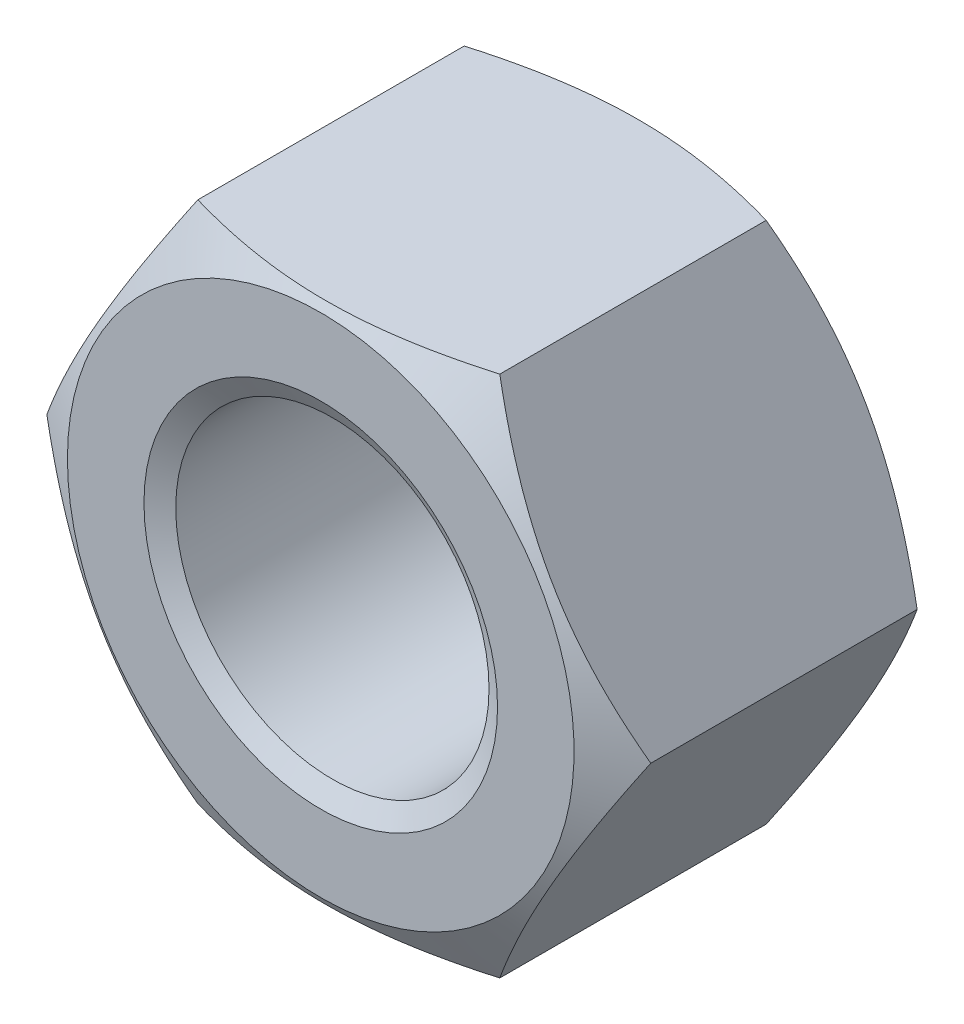
ISO-10303-21;
HEADER;
FILE_DESCRIPTION(('STEP AP214'),'2;1');
FILE_NAME('part.step','',(''),(''),'','','');
FILE_SCHEMA(('AUTOMOTIVE_DESIGN { 1 0 10303 214 1 1 1 1 }'));
ENDSEC;
DATA;
#1=APPLICATION_CONTEXT('core data for automotive mechanical design processes');
#2=APPLICATION_PROTOCOL_DEFINITION('international standard','automotive_design',2000,#1);
#3=PRODUCT_CONTEXT('',#1,'mechanical');
#4=PRODUCT('Part','Part','',(#3));
#5=PRODUCT_RELATED_PRODUCT_CATEGORY('part','',(#4));
#6=PRODUCT_DEFINITION_FORMATION('','',#4);
#7=PRODUCT_DEFINITION_CONTEXT('part definition',#1,'design');
#8=PRODUCT_DEFINITION('design','',#6,#7);
#9=PRODUCT_DEFINITION_SHAPE('','',#8);
#10=(LENGTH_UNIT() NAMED_UNIT(*) SI_UNIT(.MILLI.,.METRE.));
#11=(NAMED_UNIT(*) PLANE_ANGLE_UNIT() SI_UNIT($,.RADIAN.));
#12=(NAMED_UNIT(*) SI_UNIT($,.STERADIAN.) SOLID_ANGLE_UNIT());
#13=UNCERTAINTY_MEASURE_WITH_UNIT(LENGTH_MEASURE(1.E-05),#10,'distance_accuracy_value','');
#14=(GEOMETRIC_REPRESENTATION_CONTEXT(3) GLOBAL_UNCERTAINTY_ASSIGNED_CONTEXT((#13)) GLOBAL_UNIT_ASSIGNED_CONTEXT((#10,
#11,#12)) REPRESENTATION_CONTEXT('',''));
#15=CARTESIAN_POINT('',(0.,0.,0.));
#16=DIRECTION('',(0.,0.,1.));
#17=DIRECTION('',(1.,0.,0.));
#18=AXIS2_PLACEMENT_3D('',#15,#16,#17);
#19=CARTESIAN_POINT('',(-6.92820323027551,-12.,-14.8));
#20=DIRECTION('',(0.,-1.,0.));
#21=DIRECTION('',(0.,0.,-1.));
#22=AXIS2_PLACEMENT_3D('',#19,#20,#21);
#23=PLANE('',#22);
#24=CARTESIAN_POINT('',(-18.3446032348294,-12.,-5.94432234530974));
#25=CARTESIAN_POINT('',(-18.0812955946638,-12.,-5.81710561243375));
#26=CARTESIAN_POINT('',(-17.8176688384136,-12.,-5.69054969949485));
#27=CARTESIAN_POINT('',(-17.2897096623209,-12.,-5.43891126516321));
#28=CARTESIAN_POINT('',(-17.0253772347124,-12.,-5.31382876006806));
#29=CARTESIAN_POINT('',(-16.2311424183612,-12.,-4.94098252621636));
#30=CARTESIAN_POINT('',(-15.7000886099427,-12.,-4.69566180541669));
#31=CARTESIAN_POINT('',(-14.6312468152857,-12.,-4.21171472149423));
#32=CARTESIAN_POINT('',(-14.0934376639069,-12.,-3.97313498593905));
#33=CARTESIAN_POINT('',(-13.0133884821228,-12.,-3.50626232661434));
#34=CARTESIAN_POINT('',(-12.4711486853602,-12.,-3.27796886449834));
#35=CARTESIAN_POINT('',(-11.3747844963517,-12.,-2.83175886782212));
#36=CARTESIAN_POINT('',(-10.8205955916297,-12.,-2.61400001113825));
#37=CARTESIAN_POINT('',(-9.70566657992173,-12.,-2.19561145625574));
#38=CARTESIAN_POINT('',(-9.14492575127209,-12.,-1.99498366557309));
#39=CARTESIAN_POINT('',(-8.01718109129724,-12.,-1.6162726595594));
#40=CARTESIAN_POINT('',(-7.45019357852707,-12.,-1.43814124966033));
#41=CARTESIAN_POINT('',(-6.30810460243248,-12.,-1.11021889901846));
#42=CARTESIAN_POINT('',(-5.7330057735618,-12.,-0.960418974407531));
#43=CARTESIAN_POINT('',(-4.86416258626942,-12.,-0.762464594500082));
#44=CARTESIAN_POINT('',(-4.57344737414743,-12.,-0.700926187855609));
#45=CARTESIAN_POINT('',(-3.99008816621975,-12.,-0.587740196450425));
#46=CARTESIAN_POINT('',(-3.69744421422573,-12.,-0.536092387818568));
#47=CARTESIAN_POINT('',(-3.11042069882739,-12.,-0.443604083976513));
#48=CARTESIAN_POINT('',(-2.81604099744653,-12.,-0.402764460090437));
#49=CARTESIAN_POINT('',(-2.22590203942756,-12.,-0.332716378543997));
#50=CARTESIAN_POINT('',(-1.93014283257199,-12.,-0.303507504397735));
#51=CARTESIAN_POINT('',(-1.33951990411102,-12.,-0.257503036783128));
#52=CARTESIAN_POINT('',(-1.04466219465558,-12.,-0.240630761656445));
#53=CARTESIAN_POINT('',(-0.454498307355136,-12.,-0.219388631243676));
#54=CARTESIAN_POINT('',(-0.159192136318167,-12.,-0.21501858802417));
#55=CARTESIAN_POINT('',(0.431256758957261,-12.,-0.218884397227795));
#56=CARTESIAN_POINT('',(0.726399505811146,-12.,-0.227116740527932));
#57=CARTESIAN_POINT('',(1.31608163074935,-12.,-0.255983537626754));
#58=CARTESIAN_POINT('',(1.61062097625001,-12.,-0.276618644337873));
#59=CARTESIAN_POINT('',(2.32524257409635,-12.,-0.341301544420657));
#60=CARTESIAN_POINT('',(2.74476957297406,-12.,-0.391604825444484));
#61=CARTESIAN_POINT('',(3.58051682916534,-12.,-0.514565819726609));
#62=CARTESIAN_POINT('',(3.99673658249221,-12.,-0.587226875490416));
#63=CARTESIAN_POINT('',(5.24117103492998,-12.,-0.835099831837308));
#64=CARTESIAN_POINT('',(6.06353260270006,-12.,-1.04003542294767));
#65=CARTESIAN_POINT('',(7.29358946103183,-12.,-1.39315624184594));
#66=CARTESIAN_POINT('',(7.707717815547,-12.,-1.52020059573093));
#67=CARTESIAN_POINT('',(8.53197351898008,-12.,-1.78689253466732));
#68=CARTESIAN_POINT('',(8.94210050443802,-12.,-1.92654125302682));
#69=CARTESIAN_POINT('',(9.75630809909002,-12.,-2.21547115337127));
#70=CARTESIAN_POINT('',(10.160409777039,-12.,-2.36469346187756));
#71=CARTESIAN_POINT('',(10.7640208026103,-12.,-2.5949564228576));
#72=CARTESIAN_POINT('',(10.9647685688279,-12.,-2.67276919535956));
#73=CARTESIAN_POINT('',(11.3654854518599,-12.,-2.8303637974962));
#74=CARTESIAN_POINT('',(11.5654545840166,-12.,-2.91014558810381));
#75=CARTESIAN_POINT('',(11.7650614984094,-12.,-2.99082293189066));
#76=B_SPLINE_CURVE_WITH_KNOTS('',3,(#24,#25,#26,#27,#28,#29,#30,#31,#32,#33,#34,#35,#36,#37,#38,
#39,#40,#41,#42,#43,#44,#45,#46,#47,#48,#49,#50,#51,#52,#53,#54,#55,#56,#57,#58,#59,#60,#61,#62,
#63,#64,#65,#66,#67,#68,#69,#70,#71,#72,#73,#74,#75),.UNSPECIFIED.,.F.,.F.,(4,2,2,2,2,2,2,2,2,2,
2,2,2,2,2,2,2,2,2,2,2,2,2,2,2,4),(0.,0.877286770816364,1.75458323635082,3.50946322182771,
5.27443821052018,7.03932071923372,8.82541303032011,10.6117039612025,12.3941007071898,
14.1759313069382,15.067261254108,15.9585710238683,16.8499526265322,17.7413023068119,
18.6270633227036,19.5128110237749,20.3983121340669,21.2838598634314,22.5507356136615,
23.8178008549448,26.3568198355158,27.656250637838,28.9557983937207,30.248004617917,
30.8938984187477,31.5397794278532),.UNSPECIFIED.);
#77=CARTESIAN_POINT('',(-6.9282032302755,-12.,-1.28830312067058));
#78=VERTEX_POINT('',#77);
#79=CARTESIAN_POINT('',(6.92820323027551,-12.,-1.28830312067059));
#80=VERTEX_POINT('',#79);
#81=EDGE_CURVE('E51',#78,#80,#76,.T.);
#82=ORIENTED_EDGE('',*,*,#81,.F.);
#83=DIRECTION('',(0.,0.,1.));
#84=VECTOR('',#83,1.);
#85=CARTESIAN_POINT('',(-6.92820323027551,-12.,-14.8));
#86=LINE('',#85,#84);
#87=CARTESIAN_POINT('',(-6.92820323027551,-12.,-13.5116968793294));
#88=VERTEX_POINT('',#87);
#89=EDGE_CURVE('E106',#88,#78,#86,.T.);
#90=ORIENTED_EDGE('',*,*,#89,.F.);
#91=CARTESIAN_POINT('',(-18.3446032348294,-12.,-8.85567765469025));
#92=CARTESIAN_POINT('',(-18.0812955946638,-12.,-8.98289438756624));
#93=CARTESIAN_POINT('',(-17.8176688384136,-12.,-9.10945030050514));
#94=CARTESIAN_POINT('',(-17.2897096623209,-12.,-9.36108873483678));
#95=CARTESIAN_POINT('',(-17.0253772347124,-12.,-9.48617123993193));
#96=CARTESIAN_POINT('',(-16.2311424183612,-12.,-9.85901747378363));
#97=CARTESIAN_POINT('',(-15.7000886099427,-12.,-10.1043381945833));
#98=CARTESIAN_POINT('',(-14.6312468152857,-12.,-10.5882852785058));
#99=CARTESIAN_POINT('',(-14.0934376639069,-12.,-10.8268650140609));
#100=CARTESIAN_POINT('',(-13.0133884821228,-12.,-11.2937376733857));
#101=CARTESIAN_POINT('',(-12.4711486853602,-12.,-11.5220311355017));
#102=CARTESIAN_POINT('',(-11.3747844963517,-12.,-11.9682411321779));
#103=CARTESIAN_POINT('',(-10.8205955916297,-12.,-12.1859999888618));
#104=CARTESIAN_POINT('',(-9.70566657992173,-12.,-12.6043885437443));
#105=CARTESIAN_POINT('',(-9.14492575127208,-12.,-12.8050163344269));
#106=CARTESIAN_POINT('',(-8.01718109129724,-12.,-13.1837273404406));
#107=CARTESIAN_POINT('',(-7.45019357852706,-12.,-13.3618587503397));
#108=CARTESIAN_POINT('',(-6.30810460243248,-12.,-13.6897811009815));
#109=CARTESIAN_POINT('',(-5.7330057735618,-12.,-13.8395810255925));
#110=CARTESIAN_POINT('',(-4.86416258626942,-12.,-14.0375354054999));
#111=CARTESIAN_POINT('',(-4.57344737414742,-12.,-14.0990738121444));
#112=CARTESIAN_POINT('',(-3.99008816621975,-12.,-14.2122598035496));
#113=CARTESIAN_POINT('',(-3.69744421422573,-12.,-14.2639076121814));
#114=CARTESIAN_POINT('',(-3.11042069882739,-12.,-14.3563959160235));
#115=CARTESIAN_POINT('',(-2.81604099744653,-12.,-14.3972355399096));
#116=CARTESIAN_POINT('',(-2.22590203942756,-12.,-14.467283621456));
#117=CARTESIAN_POINT('',(-1.93014283257199,-12.,-14.4964924956023));
#118=CARTESIAN_POINT('',(-1.33951990411102,-12.,-14.5424969632169));
#119=CARTESIAN_POINT('',(-1.04466219465558,-12.,-14.5593692383436));
#120=CARTESIAN_POINT('',(-0.454498307355132,-12.,-14.5806113687563));
#121=CARTESIAN_POINT('',(-0.159192136318165,-12.,-14.5849814119758));
#122=CARTESIAN_POINT('',(0.431256758957261,-12.,-14.5811156027722));
#123=CARTESIAN_POINT('',(0.726399505811145,-12.,-14.5728832594721));
#124=CARTESIAN_POINT('',(1.31608163074935,-12.,-14.5440164623732));
#125=CARTESIAN_POINT('',(1.61062097625001,-12.,-14.5233813556621));
#126=CARTESIAN_POINT('',(2.32524257409635,-12.,-14.4586984555793));
#127=CARTESIAN_POINT('',(2.74476957297406,-12.,-14.4083951745555));
#128=CARTESIAN_POINT('',(3.58051682916534,-12.,-14.2854341802734));
#129=CARTESIAN_POINT('',(3.9967365824922,-12.,-14.2127731245096));
#130=CARTESIAN_POINT('',(5.24117103492997,-12.,-13.9649001681627));
#131=CARTESIAN_POINT('',(6.06353260270005,-12.,-13.7599645770523));
#132=CARTESIAN_POINT('',(7.29358946103182,-12.,-13.4068437581541));
#133=CARTESIAN_POINT('',(7.707717815547,-12.,-13.2797994042691));
#134=CARTESIAN_POINT('',(8.53197351898007,-12.,-13.0131074653327));
#135=CARTESIAN_POINT('',(8.94210050443801,-12.,-12.8734587469732));
#136=CARTESIAN_POINT('',(9.75630809909,-12.,-12.5845288466287));
#137=CARTESIAN_POINT('',(10.1604097770389,-12.,-12.4353065381224));
#138=CARTESIAN_POINT('',(10.7640208026103,-12.,-12.2050435771424));
#139=CARTESIAN_POINT('',(10.9647685688278,-12.,-12.1272308046404));
#140=CARTESIAN_POINT('',(11.3654854518599,-12.,-11.9696362025038));
#141=CARTESIAN_POINT('',(11.5654545840166,-12.,-11.8898544118962));
#142=CARTESIAN_POINT('',(11.7650614984094,-12.,-11.8091770681093));
#143=B_SPLINE_CURVE_WITH_KNOTS('',3,(#91,#92,#93,#94,#95,#96,#97,#98,#99,#100,#101,#102,#103,
#104,#105,#106,#107,#108,#109,#110,#111,#112,#113,#114,#115,#116,#117,#118,#119,#120,#121,#122,
#123,#124,#125,#126,#127,#128,#129,#130,#131,#132,#133,#134,#135,#136,#137,#138,#139,#140,#141,
#142),.UNSPECIFIED.,.F.,.F.,(4,2,2,2,2,2,2,2,2,2,2,2,2,2,2,2,2,2,2,2,2,2,2,2,2,4),(0.,
0.877286770816364,1.75458323635082,3.50946322182772,5.27443821052018,7.03932071923373,
8.82541303032012,10.6117039612025,12.3941007071898,14.1759313069382,15.0672612541081,
15.9585710238683,16.8499526265322,17.741302306812,18.6270633227036,19.5128110237749,
20.3983121340669,21.2838598634315,22.5507356136615,23.8178008549448,26.3568198355158,
27.656250637838,28.9557983937207,30.2480046179169,30.8938984187477,31.5397794278532),.UNSPECIFIED.);
#144=CARTESIAN_POINT('',(6.92820323027549,-12.,-13.5116968793294));
#145=VERTEX_POINT('',#144);
#146=EDGE_CURVE('E127',#145,#88,#143,.F.);
#147=ORIENTED_EDGE('',*,*,#146,.F.);
#148=DIRECTION('',(0.,0.,1.));
#149=VECTOR('',#148,1.);
#150=CARTESIAN_POINT('',(6.92820323027551,-12.,-14.8));
#151=LINE('',#150,#149);
#152=EDGE_CURVE('E124',#145,#80,#151,.T.);
#153=ORIENTED_EDGE('',*,*,#152,.T.);
#154=EDGE_LOOP('',(#82,#90,#147,#153));
#155=FACE_BOUND('',#154,.T.);
#156=ADVANCED_FACE('F36',(#155),#23,.T.);
#157=CARTESIAN_POINT('',(-13.856406460551,0.,-14.8));
#158=DIRECTION('',(-0.866025403784438,-0.5,0.));
#159=DIRECTION('',(0.5,-0.866025403784439,0.));
#160=AXIS2_PLACEMENT_3D('',#157,#158,#159);
#161=PLANE('',#160);
#162=CARTESIAN_POINT('',(-13.8565219306049,0.000199999999999872,-1.28836978817058));
#163=CARTESIAN_POINT('',(-13.7042251307133,-0.263585795242263,-1.20045598313196));
#164=CARTESIAN_POINT('',(-13.5513604901482,-0.5283551193818,-1.11653234850277));
#165=CARTESIAN_POINT('',(-13.244405350712,-1.06001701652966,-0.957772569818944));
#166=CARTESIAN_POINT('',(-13.0903144663124,-1.32691025729307,-0.882939414619687));
#167=CARTESIAN_POINT('',(-12.6255589607763,-2.13189040597901,-0.673523890800257));
#168=CARTESIAN_POINT('',(-12.3130596590925,-2.6731550738251,-0.554409587668956));
#169=CARTESIAN_POINT('',(-11.8454187840152,-3.48313282915499,-0.41473741194925));
#170=CARTESIAN_POINT('',(-11.6916742921315,-3.74942610048137,-0.37495014798655));
#171=CARTESIAN_POINT('',(-11.3834734611381,-4.28324559869684,-0.308229720163196));
#172=CARTESIAN_POINT('',(-11.2290171083848,-4.55077184921738,-0.281296803713881));
#173=CARTESIAN_POINT('',(-10.9198468953819,-5.08627036632535,-0.240974942863032));
#174=CARTESIAN_POINT('',(-10.7651335610083,-5.35424172206872,-0.227569903828425));
#175=CARTESIAN_POINT('',(-10.4555635369292,-5.89043273227404,-0.214589444703275));
#176=CARTESIAN_POINT('',(-10.3007068518009,-6.15865237880803,-0.215013597308842));
#177=CARTESIAN_POINT('',(-10.0112020648831,-6.6600893787841,-0.22872637028888));
#178=CARTESIAN_POINT('',(-9.87653331649856,-6.89334249317775,-0.240342333524638));
#179=CARTESIAN_POINT('',(-9.60750555673725,-7.35931224173077,-0.273814359818485));
#180=CARTESIAN_POINT('',(-9.47314656794544,-7.59202883677177,-0.295671147212325));
#181=CARTESIAN_POINT('',(-9.2048113451909,-8.05679907604294,-0.349243767489016));
#182=CARTESIAN_POINT('',(-9.07083551994084,-8.288852012362,-0.38096774343903));
#183=CARTESIAN_POINT('',(-8.80351197901489,-8.75186996730498,-0.453718126616546));
#184=CARTESIAN_POINT('',(-8.67016430666066,-8.98283491089354,-0.494745166129303));
#185=CARTESIAN_POINT('',(-8.2653799638421,-9.68394195876367,-0.632818004227908));
#186=CARTESIAN_POINT('',(-7.99511549730956,-10.1520537462785,-0.743631239285429));
#187=CARTESIAN_POINT('',(-7.45861659251289,-11.0812971075914,-0.995132117883984));
#188=CARTESIAN_POINT('',(-7.19237528499143,-11.5424405792922,-1.13576069360548));
#189=CARTESIAN_POINT('',(-6.92808776022167,-12.0002,-1.28836978817057));
#190=B_SPLINE_CURVE_WITH_KNOTS('',3,(#162,#163,#164,#165,#166,#167,#168,#169,#170,#171,#172,
#173,#174,#175,#176,#177,#178,#179,#180,#181,#182,#183,#184,#185,#186,#187,#188,#189),
.UNSPECIFIED.,.F.,.F.,(4,2,2,2,2,2,2,2,2,2,2,2,2,4),(0.,0.951004872251245,1.90232158356437,
3.80900466161368,4.7389455141357,5.66890426477609,6.59775529889865,7.5265776327693,
8.33514643820578,9.14377244252749,9.95306755799765,10.7624176939264,12.4167102786892,
14.0677556316691),.UNSPECIFIED.);
#191=CARTESIAN_POINT('',(-13.856406460551,0.,-1.28830312067059));
#192=VERTEX_POINT('',#191);
#193=EDGE_CURVE('E91',#192,#78,#190,.T.);
#194=ORIENTED_EDGE('',*,*,#193,.F.);
#195=DIRECTION('',(0.,0.,1.));
#196=VECTOR('',#195,1.);
#197=CARTESIAN_POINT('',(-13.856406460551,0.,-14.8));
#198=LINE('',#197,#196);
#199=CARTESIAN_POINT('',(-13.856406460551,0.,-13.5116968793294));
#200=VERTEX_POINT('',#199);
#201=EDGE_CURVE('E104',#200,#192,#198,.T.);
#202=ORIENTED_EDGE('',*,*,#201,.F.);
#203=CARTESIAN_POINT('',(-6.92808776022167,-12.0002,-13.5116302118294));
#204=CARTESIAN_POINT('',(-7.08038456011319,-11.7364142047577,-13.599544016868));
#205=CARTESIAN_POINT('',(-7.2332492006783,-11.4716448806182,-13.6834676514972));
#206=CARTESIAN_POINT('',(-7.54020434011449,-10.9399829834703,-13.8422274301811));
#207=CARTESIAN_POINT('',(-7.69429522451413,-10.6730897427069,-13.9170605853803));
#208=CARTESIAN_POINT('',(-8.15905073005027,-9.86810959402099,-14.1264761091997));
#209=CARTESIAN_POINT('',(-8.47155003173404,-9.3268449261749,-14.245590412331));
#210=CARTESIAN_POINT('',(-8.93919090681137,-8.51686717084501,-14.3852625880508));
#211=CARTESIAN_POINT('',(-9.09293539869504,-8.25057389951863,-14.4250498520135));
#212=CARTESIAN_POINT('',(-9.40113622968841,-7.71675440130316,-14.4917702798368));
#213=CARTESIAN_POINT('',(-9.55559258244173,-7.44922815078262,-14.5187031962861));
#214=CARTESIAN_POINT('',(-9.86476279544467,-6.91372963367465,-14.559025057137));
#215=CARTESIAN_POINT('',(-10.0194761298182,-6.64575827793128,-14.5724300961716));
#216=CARTESIAN_POINT('',(-10.3290461538973,-6.10956726772596,-14.5854105552967));
#217=CARTESIAN_POINT('',(-10.4839028390257,-5.84134762119197,-14.5849864026912));
#218=CARTESIAN_POINT('',(-10.7734076259435,-5.3399106212159,-14.5712736297111));
#219=CARTESIAN_POINT('',(-10.908076374328,-5.10665750682225,-14.5596576664754));
#220=CARTESIAN_POINT('',(-11.1771041340893,-4.64068775826923,-14.5261856401815));
#221=CARTESIAN_POINT('',(-11.3114631228811,-4.40797116322823,-14.5043288527877));
#222=CARTESIAN_POINT('',(-11.5797983456356,-3.94320092395706,-14.450756232511));
#223=CARTESIAN_POINT('',(-11.7137741708857,-3.711147987638,-14.419032256561));
#224=CARTESIAN_POINT('',(-11.9810977118116,-3.24813003269502,-14.3462818733835));
#225=CARTESIAN_POINT('',(-12.1144453841659,-3.01716508910646,-14.3052548338707));
#226=CARTESIAN_POINT('',(-12.5192297269844,-2.31605804123633,-14.1671819957721));
#227=CARTESIAN_POINT('',(-12.789494193517,-1.84794625372147,-14.0563687607146));
#228=CARTESIAN_POINT('',(-13.3259930983136,-0.918702892408578,-13.804867882116));
#229=CARTESIAN_POINT('',(-13.5922344058351,-0.457559420707845,-13.6642393063945));
#230=CARTESIAN_POINT('',(-13.8565219306049,0.000200000000000098,-13.5116302118294));
#231=B_SPLINE_CURVE_WITH_KNOTS('',3,(#203,#204,#205,#206,#207,#208,#209,#210,#211,#212,#213,
#214,#215,#216,#217,#218,#219,#220,#221,#222,#223,#224,#225,#226,#227,#228,#229,#230),
.UNSPECIFIED.,.F.,.F.,(4,2,2,2,2,2,2,2,2,2,2,2,2,4),(0.,0.951004872251243,1.90232158356437,
3.80900466161368,4.7389455141357,5.66890426477609,6.59775529889865,7.5265776327693,
8.33514643820578,9.14377244252749,9.95306755799765,10.7624176939264,12.4167102786892,
14.0677556316691),.UNSPECIFIED.);
#232=EDGE_CURVE('E195',#88,#200,#231,.T.);
#233=ORIENTED_EDGE('',*,*,#232,.F.);
#234=ORIENTED_EDGE('',*,*,#89,.T.);
#235=EDGE_LOOP('',(#194,#202,#233,#234));
#236=FACE_BOUND('',#235,.T.);
#237=ADVANCED_FACE('F102',(#236),#161,.T.);
#238=CARTESIAN_POINT('',(-6.92820323027551,12.,-14.8));
#239=DIRECTION('',(-0.866025403784439,0.5,0.));
#240=DIRECTION('',(-0.5,-0.866025403784439,0.));
#241=AXIS2_PLACEMENT_3D('',#238,#239,#240);
#242=PLANE('',#241);
#243=CARTESIAN_POINT('',(-6.92808776022167,12.0002,-1.28836978817058));
#244=CARTESIAN_POINT('',(-7.08038456011319,11.7364142047577,-1.20045598313196));
#245=CARTESIAN_POINT('',(-7.23324920067831,11.4716448806182,-1.11653234850277));
#246=CARTESIAN_POINT('',(-7.54020434011449,10.9399829834703,-0.957772569818942));
#247=CARTESIAN_POINT('',(-7.69429522451414,10.6730897427069,-0.882939414619685));
#248=CARTESIAN_POINT('',(-8.15905073005027,9.86810959402099,-0.673523890800255));
#249=CARTESIAN_POINT('',(-8.47155003173405,9.3268449261749,-0.554409587668954));
#250=CARTESIAN_POINT('',(-8.93919090681137,8.51686717084501,-0.414737411949249));
#251=CARTESIAN_POINT('',(-9.09293539869504,8.25057389951863,-0.37495014798655));
#252=CARTESIAN_POINT('',(-9.40113622968841,7.71675440130316,-0.308229720163196));
#253=CARTESIAN_POINT('',(-9.55559258244173,7.44922815078262,-0.281296803713881));
#254=CARTESIAN_POINT('',(-9.86476279544467,6.91372963367465,-0.240974942863032));
#255=CARTESIAN_POINT('',(-10.0194761298182,6.64575827793128,-0.227569903828424));
#256=CARTESIAN_POINT('',(-10.3290461538973,6.10956726772596,-0.214589444703274));
#257=CARTESIAN_POINT('',(-10.4839028390257,5.84134762119197,-0.215013597308842));
#258=CARTESIAN_POINT('',(-10.7734076259435,5.3399106212159,-0.228726370288881));
#259=CARTESIAN_POINT('',(-10.908076374328,5.10665750682225,-0.240342333524639));
#260=CARTESIAN_POINT('',(-11.1771041340893,4.64068775826924,-0.273814359818486));
#261=CARTESIAN_POINT('',(-11.3114631228811,4.40797116322823,-0.295671147212327));
#262=CARTESIAN_POINT('',(-11.5797983456356,3.94320092395706,-0.349243767489019));
#263=CARTESIAN_POINT('',(-11.7137741708857,3.711147987638,-0.380967743439032));
#264=CARTESIAN_POINT('',(-11.9810977118116,3.24813003269502,-0.453718126616548));
#265=CARTESIAN_POINT('',(-12.1144453841659,3.01716508910646,-0.494745166129304));
#266=CARTESIAN_POINT('',(-12.5192297269844,2.31605804123633,-0.632818004227908));
#267=CARTESIAN_POINT('',(-12.789494193517,1.84794625372147,-0.743631239285431));
#268=CARTESIAN_POINT('',(-13.3259930983136,0.918702892408579,-0.995132117883988));
#269=CARTESIAN_POINT('',(-13.5922344058351,0.457559420707845,-1.13576069360549));
#270=CARTESIAN_POINT('',(-13.8565219306049,-0.000199999999999919,-1.28836978817058));
#271=B_SPLINE_CURVE_WITH_KNOTS('',3,(#243,#244,#245,#246,#247,#248,#249,#250,#251,#252,#253,
#254,#255,#256,#257,#258,#259,#260,#261,#262,#263,#264,#265,#266,#267,#268,#269,#270),
.UNSPECIFIED.,.F.,.F.,(4,2,2,2,2,2,2,2,2,2,2,2,2,4),(0.,0.951004872251244,1.90232158356437,
3.80900466161368,4.7389455141357,5.66890426477609,6.59775529889865,7.5265776327693,
8.33514643820578,9.14377244252749,9.95306755799765,10.7624176939264,12.4167102786892,
14.0677556316691),.UNSPECIFIED.);
#272=CARTESIAN_POINT('',(-6.92820323027552,12.,-1.28830312067058));
#273=VERTEX_POINT('',#272);
#274=EDGE_CURVE('E87',#273,#192,#271,.T.);
#275=ORIENTED_EDGE('',*,*,#274,.F.);
#276=DIRECTION('',(0.,0.,1.));
#277=VECTOR('',#276,1.);
#278=CARTESIAN_POINT('',(-6.92820323027551,12.,-14.8));
#279=LINE('',#278,#277);
#280=CARTESIAN_POINT('',(-6.92820323027552,12.,-13.5116968793294));
#281=VERTEX_POINT('',#280);
#282=EDGE_CURVE('E111',#281,#273,#279,.T.);
#283=ORIENTED_EDGE('',*,*,#282,.F.);
#284=CARTESIAN_POINT('',(-13.8565219306049,-0.000200000000000196,-13.5116302118294));
#285=CARTESIAN_POINT('',(-13.7042251307133,0.263585795242261,-13.599544016868));
#286=CARTESIAN_POINT('',(-13.5513604901482,0.528355119381798,-13.6834676514972));
#287=CARTESIAN_POINT('',(-13.244405350712,1.06001701652966,-13.8422274301811));
#288=CARTESIAN_POINT('',(-13.0903144663124,1.32691025729307,-13.9170605853803));
#289=CARTESIAN_POINT('',(-12.6255589607763,2.13189040597901,-14.1264761091997));
#290=CARTESIAN_POINT('',(-12.3130596590925,2.6731550738251,-14.245590412331));
#291=CARTESIAN_POINT('',(-11.8454187840152,3.48313282915499,-14.3852625880507));
#292=CARTESIAN_POINT('',(-11.6916742921315,3.74942610048137,-14.4250498520134));
#293=CARTESIAN_POINT('',(-11.3834734611381,4.28324559869684,-14.4917702798368));
#294=CARTESIAN_POINT('',(-11.2290171083848,4.55077184921738,-14.5187031962861));
#295=CARTESIAN_POINT('',(-10.9198468953819,5.08627036632535,-14.559025057137));
#296=CARTESIAN_POINT('',(-10.7651335610083,5.35424172206872,-14.5724300961716));
#297=CARTESIAN_POINT('',(-10.4555635369292,5.89043273227404,-14.5854105552967));
#298=CARTESIAN_POINT('',(-10.3007068518009,6.15865237880804,-14.5849864026912));
#299=CARTESIAN_POINT('',(-10.0112020648831,6.6600893787841,-14.5712736297111));
#300=CARTESIAN_POINT('',(-9.87653331649856,6.89334249317775,-14.5596576664754));
#301=CARTESIAN_POINT('',(-9.60750555673725,7.35931224173076,-14.5261856401815));
#302=CARTESIAN_POINT('',(-9.47314656794544,7.59202883677177,-14.5043288527877));
#303=CARTESIAN_POINT('',(-9.2048113451909,8.05679907604294,-14.450756232511));
#304=CARTESIAN_POINT('',(-9.07083551994085,8.288852012362,-14.419032256561));
#305=CARTESIAN_POINT('',(-8.80351197901489,8.75186996730498,-14.3462818733835));
#306=CARTESIAN_POINT('',(-8.67016430666067,8.98283491089354,-14.3052548338707));
#307=CARTESIAN_POINT('',(-8.2653799638421,9.68394195876367,-14.1671819957721));
#308=CARTESIAN_POINT('',(-7.99511549730956,10.1520537462785,-14.0563687607146));
#309=CARTESIAN_POINT('',(-7.45861659251289,11.0812971075914,-13.804867882116));
#310=CARTESIAN_POINT('',(-7.19237528499143,11.5424405792922,-13.6642393063945));
#311=CARTESIAN_POINT('',(-6.92808776022167,12.0002,-13.5116302118294));
#312=B_SPLINE_CURVE_WITH_KNOTS('',3,(#284,#285,#286,#287,#288,#289,#290,#291,#292,#293,#294,
#295,#296,#297,#298,#299,#300,#301,#302,#303,#304,#305,#306,#307,#308,#309,#310,#311),
.UNSPECIFIED.,.F.,.F.,(4,2,2,2,2,2,2,2,2,2,2,2,2,4),(0.,0.951004872251243,1.90232158356437,
3.80900466161368,4.7389455141357,5.66890426477609,6.59775529889865,7.5265776327693,
8.33514643820578,9.14377244252749,9.95306755799765,10.7624176939264,12.4167102786892,
14.0677556316691),.UNSPECIFIED.);
#313=EDGE_CURVE('E110',#200,#281,#312,.T.);
#314=ORIENTED_EDGE('',*,*,#313,.F.);
#315=ORIENTED_EDGE('',*,*,#201,.T.);
#316=EDGE_LOOP('',(#275,#283,#314,#315));
#317=FACE_BOUND('',#316,.T.);
#318=ADVANCED_FACE('F109',(#317),#242,.T.);
#319=CARTESIAN_POINT('',(6.9282032302755,12.,-14.8));
#320=DIRECTION('',(0.,1.,0.));
#321=DIRECTION('',(0.,0.,1.));
#322=AXIS2_PLACEMENT_3D('',#319,#320,#321);
#323=PLANE('',#322);
#324=CARTESIAN_POINT('',(-18.3446032348294,12.,-5.94432234530974));
#325=CARTESIAN_POINT('',(-18.0812955946638,12.,-5.81710561243375));
#326=CARTESIAN_POINT('',(-17.8176688384136,12.,-5.69054969949485));
#327=CARTESIAN_POINT('',(-17.2897096623209,12.,-5.43891126516321));
#328=CARTESIAN_POINT('',(-17.0253772347124,12.,-5.31382876006806));
#329=CARTESIAN_POINT('',(-16.2311424183612,12.,-4.94098252621636));
#330=CARTESIAN_POINT('',(-15.7000886099427,12.,-4.69566180541669));
#331=CARTESIAN_POINT('',(-14.6312468152857,12.,-4.21171472149423));
#332=CARTESIAN_POINT('',(-14.0934376639069,12.,-3.97313498593905));
#333=CARTESIAN_POINT('',(-13.0133884821228,12.,-3.50626232661434));
#334=CARTESIAN_POINT('',(-12.4711486853602,12.,-3.27796886449833));
#335=CARTESIAN_POINT('',(-11.3747844963517,12.,-2.83175886782212));
#336=CARTESIAN_POINT('',(-10.8205955916297,12.,-2.61400001113824));
#337=CARTESIAN_POINT('',(-9.70566657992173,12.,-2.19561145625573));
#338=CARTESIAN_POINT('',(-9.14492575127208,12.,-1.99498366557309));
#339=CARTESIAN_POINT('',(-8.01718109129723,12.,-1.61627265955939));
#340=CARTESIAN_POINT('',(-7.45019357852706,12.,-1.43814124966033));
#341=CARTESIAN_POINT('',(-6.30810460243248,12.,-1.11021889901846));
#342=CARTESIAN_POINT('',(-5.7330057735618,12.,-0.960418974407529));
#343=CARTESIAN_POINT('',(-4.86416258626942,12.,-0.762464594500082));
#344=CARTESIAN_POINT('',(-4.57344737414742,12.,-0.700926187855609));
#345=CARTESIAN_POINT('',(-3.99008816621975,12.,-0.587740196450425));
#346=CARTESIAN_POINT('',(-3.69744421422573,12.,-0.536092387818568));
#347=CARTESIAN_POINT('',(-3.11042069882739,12.,-0.443604083976513));
#348=CARTESIAN_POINT('',(-2.81604099744653,12.,-0.402764460090437));
#349=CARTESIAN_POINT('',(-2.22590203942756,12.,-0.332716378543998));
#350=CARTESIAN_POINT('',(-1.93014283257199,12.,-0.303507504397735));
#351=CARTESIAN_POINT('',(-1.33951990411102,12.,-0.257503036783128));
#352=CARTESIAN_POINT('',(-1.04466219465558,12.,-0.240630761656445));
#353=CARTESIAN_POINT('',(-0.454498307355138,12.,-0.219388631243677));
#354=CARTESIAN_POINT('',(-0.159192136318171,12.,-0.21501858802417));
#355=CARTESIAN_POINT('',(0.431256758957257,12.,-0.218884397227795));
#356=CARTESIAN_POINT('',(0.726399505811141,12.,-0.227116740527931));
#357=CARTESIAN_POINT('',(1.31608163074935,12.,-0.255983537626753));
#358=CARTESIAN_POINT('',(1.61062097625,12.,-0.276618644337873));
#359=CARTESIAN_POINT('',(2.32524257409635,12.,-0.341301544420657));
#360=CARTESIAN_POINT('',(2.74476957297406,12.,-0.391604825444483));
#361=CARTESIAN_POINT('',(3.58051682916534,12.,-0.514565819726608));
#362=CARTESIAN_POINT('',(3.99673658249221,12.,-0.587226875490415));
#363=CARTESIAN_POINT('',(5.24117103492998,12.,-0.835099831837309));
#364=CARTESIAN_POINT('',(6.06353260270006,12.,-1.04003542294767));
#365=CARTESIAN_POINT('',(7.29358946103183,12.,-1.39315624184594));
#366=CARTESIAN_POINT('',(7.70771781554701,12.,-1.52020059573093));
#367=CARTESIAN_POINT('',(8.53197351898008,12.,-1.78689253466732));
#368=CARTESIAN_POINT('',(8.94210050443802,12.,-1.92654125302682));
#369=CARTESIAN_POINT('',(9.75630809909001,12.,-2.21547115337127));
#370=CARTESIAN_POINT('',(10.160409777039,12.,-2.36469346187756));
#371=CARTESIAN_POINT('',(10.7640208026103,12.,-2.5949564228576));
#372=CARTESIAN_POINT('',(10.9647685688279,12.,-2.67276919535956));
#373=CARTESIAN_POINT('',(11.3654854518599,12.,-2.8303637974962));
#374=CARTESIAN_POINT('',(11.5654545840166,12.,-2.91014558810381));
#375=CARTESIAN_POINT('',(11.7650614984094,12.,-2.99082293189066));
#376=B_SPLINE_CURVE_WITH_KNOTS('',3,(#324,#325,#326,#327,#328,#329,#330,#331,#332,#333,#334,
#335,#336,#337,#338,#339,#340,#341,#342,#343,#344,#345,#346,#347,#348,#349,#350,#351,#352,#353,
#354,#355,#356,#357,#358,#359,#360,#361,#362,#363,#364,#365,#366,#367,#368,#369,#370,#371,#372,
#373,#374,#375),.UNSPECIFIED.,.F.,.F.,(4,2,2,2,2,2,2,2,2,2,2,2,2,2,2,2,2,2,2,2,2,2,2,2,2,4),(0.,
0.877286770816368,1.75458323635082,3.50946322182772,5.27443821052018,7.03932071923373,
8.82541303032012,10.6117039612025,12.3941007071898,14.1759313069382,15.067261254108,
15.9585710238683,16.8499526265322,17.7413023068119,18.6270633227036,19.5128110237749,
20.3983121340669,21.2838598634315,22.5507356136615,23.8178008549448,26.3568198355158,
27.656250637838,28.9557983937207,30.248004617917,30.8938984187477,31.5397794278532),.UNSPECIFIED.);
#377=CARTESIAN_POINT('',(6.9282032302755,12.,-1.28830312067058));
#378=VERTEX_POINT('',#377);
#379=EDGE_CURVE('E93',#378,#273,#376,.F.);
#380=ORIENTED_EDGE('',*,*,#379,.F.);
#381=DIRECTION('',(0.,0.,1.));
#382=VECTOR('',#381,1.);
#383=CARTESIAN_POINT('',(6.9282032302755,12.,-14.8));
#384=LINE('',#383,#382);
#385=CARTESIAN_POINT('',(6.92820323027549,12.,-13.5116968793294));
#386=VERTEX_POINT('',#385);
#387=EDGE_CURVE('E115',#386,#378,#384,.T.);
#388=ORIENTED_EDGE('',*,*,#387,.F.);
#389=CARTESIAN_POINT('',(-18.3446032348294,12.,-8.85567765469025));
#390=CARTESIAN_POINT('',(-18.0812955946638,12.,-8.98289438756624));
#391=CARTESIAN_POINT('',(-17.8176688384136,12.,-9.10945030050514));
#392=CARTESIAN_POINT('',(-17.2897096623209,12.,-9.36108873483678));
#393=CARTESIAN_POINT('',(-17.0253772347124,12.,-9.48617123993193));
#394=CARTESIAN_POINT('',(-16.2311424183612,12.,-9.85901747378363));
#395=CARTESIAN_POINT('',(-15.7000886099427,12.,-10.1043381945833));
#396=CARTESIAN_POINT('',(-14.6312468152857,12.,-10.5882852785058));
#397=CARTESIAN_POINT('',(-14.0934376639069,12.,-10.8268650140609));
#398=CARTESIAN_POINT('',(-13.0133884821228,12.,-11.2937376733857));
#399=CARTESIAN_POINT('',(-12.4711486853602,12.,-11.5220311355017));
#400=CARTESIAN_POINT('',(-11.3747844963517,12.,-11.9682411321779));
#401=CARTESIAN_POINT('',(-10.8205955916297,12.,-12.1859999888618));
#402=CARTESIAN_POINT('',(-9.70566657992173,12.,-12.6043885437443));
#403=CARTESIAN_POINT('',(-9.14492575127209,12.,-12.8050163344269));
#404=CARTESIAN_POINT('',(-8.01718109129724,12.,-13.1837273404406));
#405=CARTESIAN_POINT('',(-7.45019357852707,12.,-13.3618587503397));
#406=CARTESIAN_POINT('',(-6.30810460243248,12.,-13.6897811009815));
#407=CARTESIAN_POINT('',(-5.7330057735618,12.,-13.8395810255925));
#408=CARTESIAN_POINT('',(-4.86416258626942,12.,-14.0375354054999));
#409=CARTESIAN_POINT('',(-4.57344737414742,12.,-14.0990738121444));
#410=CARTESIAN_POINT('',(-3.99008816621975,12.,-14.2122598035496));
#411=CARTESIAN_POINT('',(-3.69744421422573,12.,-14.2639076121814));
#412=CARTESIAN_POINT('',(-3.11042069882739,12.,-14.3563959160235));
#413=CARTESIAN_POINT('',(-2.81604099744653,12.,-14.3972355399096));
#414=CARTESIAN_POINT('',(-2.22590203942757,12.,-14.467283621456));
#415=CARTESIAN_POINT('',(-1.93014283257199,12.,-14.4964924956023));
#416=CARTESIAN_POINT('',(-1.33951990411102,12.,-14.5424969632169));
#417=CARTESIAN_POINT('',(-1.04466219465558,12.,-14.5593692383436));
#418=CARTESIAN_POINT('',(-0.454498307355137,12.,-14.5806113687563));
#419=CARTESIAN_POINT('',(-0.15919213631817,12.,-14.5849814119758));
#420=CARTESIAN_POINT('',(0.431256758957257,12.,-14.5811156027722));
#421=CARTESIAN_POINT('',(0.726399505811142,12.,-14.5728832594721));
#422=CARTESIAN_POINT('',(1.31608163074935,12.,-14.5440164623732));
#423=CARTESIAN_POINT('',(1.61062097625,12.,-14.5233813556621));
#424=CARTESIAN_POINT('',(2.32524257409635,12.,-14.4586984555793));
#425=CARTESIAN_POINT('',(2.74476957297406,12.,-14.4083951745555));
#426=CARTESIAN_POINT('',(3.58051682916534,12.,-14.2854341802734));
#427=CARTESIAN_POINT('',(3.9967365824922,12.,-14.2127731245096));
#428=CARTESIAN_POINT('',(5.24117103492997,12.,-13.9649001681627));
#429=CARTESIAN_POINT('',(6.06353260270005,12.,-13.7599645770523));
#430=CARTESIAN_POINT('',(7.29358946103182,12.,-13.4068437581541));
#431=CARTESIAN_POINT('',(7.70771781554699,12.,-13.2797994042691));
#432=CARTESIAN_POINT('',(8.53197351898006,12.,-13.0131074653327));
#433=CARTESIAN_POINT('',(8.942100504438,12.,-12.8734587469732));
#434=CARTESIAN_POINT('',(9.75630809909,12.,-12.5845288466287));
#435=CARTESIAN_POINT('',(10.1604097770389,12.,-12.4353065381224));
#436=CARTESIAN_POINT('',(10.7640208026103,12.,-12.2050435771424));
#437=CARTESIAN_POINT('',(10.9647685688278,12.,-12.1272308046404));
#438=CARTESIAN_POINT('',(11.3654854518599,12.,-11.9696362025038));
#439=CARTESIAN_POINT('',(11.5654545840166,12.,-11.8898544118962));
#440=CARTESIAN_POINT('',(11.7650614984094,12.,-11.8091770681093));
#441=B_SPLINE_CURVE_WITH_KNOTS('',3,(#389,#390,#391,#392,#393,#394,#395,#396,#397,#398,#399,
#400,#401,#402,#403,#404,#405,#406,#407,#408,#409,#410,#411,#412,#413,#414,#415,#416,#417,#418,
#419,#420,#421,#422,#423,#424,#425,#426,#427,#428,#429,#430,#431,#432,#433,#434,#435,#436,#437,
#438,#439,#440),.UNSPECIFIED.,.F.,.F.,(4,2,2,2,2,2,2,2,2,2,2,2,2,2,2,2,2,2,2,2,2,2,2,2,2,4),(0.,
0.877286770816368,1.75458323635082,3.50946322182772,5.27443821052018,7.03932071923372,
8.82541303032012,10.6117039612025,12.3941007071898,14.1759313069382,15.0672612541081,
15.9585710238683,16.8499526265322,17.741302306812,18.6270633227036,19.5128110237749,
20.3983121340669,21.2838598634315,22.5507356136615,23.8178008549448,26.3568198355158,
27.6562506378379,28.9557983937207,30.2480046179169,30.8938984187477,31.5397794278532),.UNSPECIFIED.);
#442=EDGE_CURVE('E184',#281,#386,#441,.T.);
#443=ORIENTED_EDGE('',*,*,#442,.F.);
#444=ORIENTED_EDGE('',*,*,#282,.T.);
#445=EDGE_LOOP('',(#380,#388,#443,#444));
#446=FACE_BOUND('',#445,.T.);
#447=ADVANCED_FACE('F224',(#446),#323,.T.);
#448=CARTESIAN_POINT('',(13.856406460551,0.,-14.8));
#449=DIRECTION('',(0.866025403784438,0.5,0.));
#450=DIRECTION('',(-0.5,0.866025403784438,0.));
#451=AXIS2_PLACEMENT_3D('',#448,#449,#450);
#452=PLANE('',#451);
#453=CARTESIAN_POINT('',(13.8565219306049,-0.000199999999995672,-1.28836978817057));
#454=CARTESIAN_POINT('',(13.7042251307133,0.263585795242267,-1.20045598313196));
#455=CARTESIAN_POINT('',(13.5513604901482,0.528355119381804,-1.11653234850276));
#456=CARTESIAN_POINT('',(13.244405350712,1.06001701652967,-0.95777256981894));
#457=CARTESIAN_POINT('',(13.0903144663124,1.32691025729307,-0.882939414619682));
#458=CARTESIAN_POINT('',(12.6255589607763,2.13189040597901,-0.673523890800252));
#459=CARTESIAN_POINT('',(12.3130596590925,2.6731550738251,-0.554409587668953));
#460=CARTESIAN_POINT('',(11.8454187840152,3.483132829155,-0.414737411949248));
#461=CARTESIAN_POINT('',(11.6916742921315,3.74942610048137,-0.374950147986548));
#462=CARTESIAN_POINT('',(11.3834734611381,4.28324559869684,-0.308229720163194));
#463=CARTESIAN_POINT('',(11.2290171083848,4.55077184921738,-0.281296803713879));
#464=CARTESIAN_POINT('',(10.9198468953819,5.08627036632535,-0.24097494286303));
#465=CARTESIAN_POINT('',(10.7651335610083,5.35424172206873,-0.227569903828422));
#466=CARTESIAN_POINT('',(10.4555635369292,5.89043273227404,-0.214589444703271));
#467=CARTESIAN_POINT('',(10.3007068518009,6.15865237880804,-0.215013597308838));
#468=CARTESIAN_POINT('',(10.011202064883,6.6600893787841,-0.228726370288877));
#469=CARTESIAN_POINT('',(9.87653331649855,6.89334249317776,-0.240342333524635));
#470=CARTESIAN_POINT('',(9.60750555673725,7.35931224173077,-0.273814359818483));
#471=CARTESIAN_POINT('',(9.47314656794544,7.59202883677177,-0.295671147212323));
#472=CARTESIAN_POINT('',(9.2048113451909,8.05679907604294,-0.349243767489014));
#473=CARTESIAN_POINT('',(9.07083551994084,8.288852012362,-0.380967743439028));
#474=CARTESIAN_POINT('',(8.80351197901489,8.75186996730498,-0.453718126616544));
#475=CARTESIAN_POINT('',(8.67016430666066,8.98283491089354,-0.494745166129301));
#476=CARTESIAN_POINT('',(8.2653799638421,9.68394195876367,-0.632818004227906));
#477=CARTESIAN_POINT('',(7.99511549730956,10.1520537462785,-0.743631239285427));
#478=CARTESIAN_POINT('',(7.45861659251288,11.0812971075914,-0.995132117883981));
#479=CARTESIAN_POINT('',(7.19237528499143,11.5424405792922,-1.13576069360548));
#480=CARTESIAN_POINT('',(6.92808776022167,12.0002,-1.28836978817057));
#481=B_SPLINE_CURVE_WITH_KNOTS('',3,(#453,#454,#455,#456,#457,#458,#459,#460,#461,#462,#463,
#464,#465,#466,#467,#468,#469,#470,#471,#472,#473,#474,#475,#476,#477,#478,#479,#480),
.UNSPECIFIED.,.F.,.F.,(4,2,2,2,2,2,2,2,2,2,2,2,2,4),(0.,0.951004872251244,1.90232158356437,
3.80900466161368,4.7389455141357,5.66890426477609,6.59775529889865,7.5265776327693,
8.33514643820578,9.14377244252749,9.95306755799765,10.7624176939264,12.4167102786892,
14.0677556316691),.UNSPECIFIED.);
#482=CARTESIAN_POINT('',(13.856406460551,0.,-1.28830312067058));
#483=VERTEX_POINT('',#482);
#484=EDGE_CURVE('E219',#483,#378,#481,.T.);
#485=ORIENTED_EDGE('',*,*,#484,.F.);
#486=DIRECTION('',(0.,0.,1.));
#487=VECTOR('',#486,1.);
#488=CARTESIAN_POINT('',(13.856406460551,0.,-14.8));
#489=LINE('',#488,#487);
#490=CARTESIAN_POINT('',(13.856406460551,0.,-13.5116968793294));
#491=VERTEX_POINT('',#490);
#492=EDGE_CURVE('E121',#491,#483,#489,.T.);
#493=ORIENTED_EDGE('',*,*,#492,.F.);
#494=CARTESIAN_POINT('',(6.92808776022167,12.0002,-13.5116302118294));
#495=CARTESIAN_POINT('',(7.08038456011319,11.7364142047577,-13.599544016868));
#496=CARTESIAN_POINT('',(7.2332492006783,11.4716448806182,-13.6834676514972));
#497=CARTESIAN_POINT('',(7.54020434011449,10.9399829834703,-13.8422274301811));
#498=CARTESIAN_POINT('',(7.69429522451413,10.6730897427069,-13.9170605853803));
#499=CARTESIAN_POINT('',(8.15905073005027,9.86810959402099,-14.1264761091997));
#500=CARTESIAN_POINT('',(8.47155003173404,9.3268449261749,-14.245590412331));
#501=CARTESIAN_POINT('',(8.93919090681137,8.51686717084501,-14.3852625880508));
#502=CARTESIAN_POINT('',(9.09293539869503,8.25057389951863,-14.4250498520134));
#503=CARTESIAN_POINT('',(9.40113622968841,7.71675440130317,-14.4917702798368));
#504=CARTESIAN_POINT('',(9.55559258244173,7.44922815078262,-14.5187031962861));
#505=CARTESIAN_POINT('',(9.86476279544466,6.91372963367465,-14.559025057137));
#506=CARTESIAN_POINT('',(10.0194761298182,6.64575827793128,-14.5724300961716));
#507=CARTESIAN_POINT('',(10.3290461538973,6.10956726772597,-14.5854105552967));
#508=CARTESIAN_POINT('',(10.4839028390257,5.84134762119197,-14.5849864026912));
#509=CARTESIAN_POINT('',(10.7734076259435,5.3399106212159,-14.5712736297111));
#510=CARTESIAN_POINT('',(10.908076374328,5.10665750682225,-14.5596576664754));
#511=CARTESIAN_POINT('',(11.1771041340893,4.64068775826924,-14.5261856401815));
#512=CARTESIAN_POINT('',(11.3114631228811,4.40797116322824,-14.5043288527877));
#513=CARTESIAN_POINT('',(11.5797983456356,3.94320092395706,-14.450756232511));
#514=CARTESIAN_POINT('',(11.7137741708857,3.711147987638,-14.419032256561));
#515=CARTESIAN_POINT('',(11.9810977118116,3.24813003269503,-14.3462818733835));
#516=CARTESIAN_POINT('',(12.1144453841659,3.01716508910647,-14.3052548338707));
#517=CARTESIAN_POINT('',(12.5192297269844,2.31605804123634,-14.1671819957721));
#518=CARTESIAN_POINT('',(12.789494193517,1.84794625372148,-14.0563687607146));
#519=CARTESIAN_POINT('',(13.3259930983136,0.918702892408585,-13.804867882116));
#520=CARTESIAN_POINT('',(13.5922344058351,0.457559420707852,-13.6642393063945));
#521=CARTESIAN_POINT('',(13.8565219306049,-0.000199999999993773,-13.5116302118294));
#522=B_SPLINE_CURVE_WITH_KNOTS('',3,(#494,#495,#496,#497,#498,#499,#500,#501,#502,#503,#504,
#505,#506,#507,#508,#509,#510,#511,#512,#513,#514,#515,#516,#517,#518,#519,#520,#521),
.UNSPECIFIED.,.F.,.F.,(4,2,2,2,2,2,2,2,2,2,2,2,2,4),(0.,0.951004872251244,1.90232158356437,
3.80900466161368,4.7389455141357,5.66890426477609,6.59775529889865,7.5265776327693,
8.33514643820578,9.14377244252749,9.95306755799765,10.7624176939264,12.4167102786892,
14.0677556316691),.UNSPECIFIED.);
#523=EDGE_CURVE('E59',#386,#491,#522,.T.);
#524=ORIENTED_EDGE('',*,*,#523,.F.);
#525=ORIENTED_EDGE('',*,*,#387,.T.);
#526=EDGE_LOOP('',(#485,#493,#524,#525));
#527=FACE_BOUND('',#526,.T.);
#528=ADVANCED_FACE('F227',(#527),#452,.T.);
#529=CARTESIAN_POINT('',(6.92820323027551,-12.,-14.8));
#530=DIRECTION('',(0.866025403784439,-0.5,0.));
#531=DIRECTION('',(0.5,0.866025403784439,0.));
#532=AXIS2_PLACEMENT_3D('',#529,#530,#531);
#533=PLANE('',#532);
#534=CARTESIAN_POINT('',(6.92808776022167,-12.0002,-1.28836978817057));
#535=CARTESIAN_POINT('',(7.08038456011319,-11.7364142047577,-1.20045598313196));
#536=CARTESIAN_POINT('',(7.2332492006783,-11.4716448806182,-1.11653234850276));
#537=CARTESIAN_POINT('',(7.54020434011449,-10.9399829834703,-0.957772569818939));
#538=CARTESIAN_POINT('',(7.69429522451413,-10.6730897427069,-0.882939414619682));
#539=CARTESIAN_POINT('',(8.15905073005027,-9.86810959402099,-0.673523890800252));
#540=CARTESIAN_POINT('',(8.47155003173404,-9.3268449261749,-0.554409587668952));
#541=CARTESIAN_POINT('',(8.93919090681137,-8.51686717084501,-0.414737411949247));
#542=CARTESIAN_POINT('',(9.09293539869503,-8.25057389951863,-0.374950147986547));
#543=CARTESIAN_POINT('',(9.4011362296884,-7.71675440130317,-0.308229720163194));
#544=CARTESIAN_POINT('',(9.55559258244173,-7.44922815078262,-0.281296803713878));
#545=CARTESIAN_POINT('',(9.86476279544466,-6.91372963367465,-0.240974942863029));
#546=CARTESIAN_POINT('',(10.0194761298182,-6.64575827793128,-0.227569903828421));
#547=CARTESIAN_POINT('',(10.3290461538973,-6.10956726772597,-0.214589444703271));
#548=CARTESIAN_POINT('',(10.4839028390257,-5.84134762119197,-0.215013597308838));
#549=CARTESIAN_POINT('',(10.7734076259435,-5.3399106212159,-0.228726370288876));
#550=CARTESIAN_POINT('',(10.908076374328,-5.10665750682225,-0.240342333524634));
#551=CARTESIAN_POINT('',(11.1771041340893,-4.64068775826924,-0.273814359818481));
#552=CARTESIAN_POINT('',(11.3114631228811,-4.40797116322823,-0.295671147212322));
#553=CARTESIAN_POINT('',(11.5797983456356,-3.94320092395706,-0.349243767489014));
#554=CARTESIAN_POINT('',(11.7137741708857,-3.711147987638,-0.380967743439027));
#555=CARTESIAN_POINT('',(11.9810977118116,-3.24813003269502,-0.453718126616543));
#556=CARTESIAN_POINT('',(12.1144453841659,-3.01716508910646,-0.4947451661293));
#557=CARTESIAN_POINT('',(12.5192297269844,-2.31605804123633,-0.632818004227905));
#558=CARTESIAN_POINT('',(12.789494193517,-1.84794625372147,-0.743631239285427));
#559=CARTESIAN_POINT('',(13.3259930983136,-0.918702892408574,-0.995132117883983));
#560=CARTESIAN_POINT('',(13.5922344058351,-0.457559420707842,-1.13576069360548));
#561=CARTESIAN_POINT('',(13.8565219306049,0.000200000000004937,-1.28836978817057));
#562=B_SPLINE_CURVE_WITH_KNOTS('',3,(#534,#535,#536,#537,#538,#539,#540,#541,#542,#543,#544,
#545,#546,#547,#548,#549,#550,#551,#552,#553,#554,#555,#556,#557,#558,#559,#560,#561),
.UNSPECIFIED.,.F.,.F.,(4,2,2,2,2,2,2,2,2,2,2,2,2,4),(0.,0.951004872251244,1.90232158356437,
3.80900466161368,4.7389455141357,5.66890426477609,6.59775529889865,7.52657763276929,
8.33514643820578,9.14377244252749,9.95306755799765,10.7624176939264,12.4167102786892,
14.0677556316691),.UNSPECIFIED.);
#563=EDGE_CURVE('E248',#80,#483,#562,.T.);
#564=ORIENTED_EDGE('',*,*,#563,.F.);
#565=ORIENTED_EDGE('',*,*,#152,.F.);
#566=CARTESIAN_POINT('',(13.8565219306049,0.000200000000004453,-13.5116302118294));
#567=CARTESIAN_POINT('',(13.7042251307133,-0.263585795242258,-13.599544016868));
#568=CARTESIAN_POINT('',(13.5513604901482,-0.528355119381796,-13.6834676514972));
#569=CARTESIAN_POINT('',(13.244405350712,-1.06001701652966,-13.8422274301811));
#570=CARTESIAN_POINT('',(13.0903144663124,-1.32691025729307,-13.9170605853803));
#571=CARTESIAN_POINT('',(12.6255589607763,-2.131890405979,-14.1264761091997));
#572=CARTESIAN_POINT('',(12.3130596590925,-2.6731550738251,-14.245590412331));
#573=CARTESIAN_POINT('',(11.8454187840152,-3.48313282915499,-14.3852625880508));
#574=CARTESIAN_POINT('',(11.6916742921315,-3.74942610048137,-14.4250498520135));
#575=CARTESIAN_POINT('',(11.3834734611381,-4.28324559869683,-14.4917702798368));
#576=CARTESIAN_POINT('',(11.2290171083848,-4.55077184921737,-14.5187031962861));
#577=CARTESIAN_POINT('',(10.9198468953819,-5.08627036632534,-14.559025057137));
#578=CARTESIAN_POINT('',(10.7651335610083,-5.35424172206872,-14.5724300961716));
#579=CARTESIAN_POINT('',(10.4555635369292,-5.89043273227403,-14.5854105552967));
#580=CARTESIAN_POINT('',(10.3007068518009,-6.15865237880803,-14.5849864026912));
#581=CARTESIAN_POINT('',(10.0112020648831,-6.6600893787841,-14.5712736297111));
#582=CARTESIAN_POINT('',(9.87653331649856,-6.89334249317775,-14.5596576664754));
#583=CARTESIAN_POINT('',(9.60750555673725,-7.35931224173076,-14.5261856401815));
#584=CARTESIAN_POINT('',(9.47314656794544,-7.59202883677176,-14.5043288527877));
#585=CARTESIAN_POINT('',(9.2048113451909,-8.05679907604294,-14.450756232511));
#586=CARTESIAN_POINT('',(9.07083551994085,-8.28885201236199,-14.419032256561));
#587=CARTESIAN_POINT('',(8.80351197901489,-8.75186996730497,-14.3462818733835));
#588=CARTESIAN_POINT('',(8.67016430666066,-8.98283491089354,-14.3052548338707));
#589=CARTESIAN_POINT('',(8.2653799638421,-9.68394195876366,-14.1671819957721));
#590=CARTESIAN_POINT('',(7.99511549730956,-10.1520537462785,-14.0563687607146));
#591=CARTESIAN_POINT('',(7.45861659251289,-11.0812971075914,-13.804867882116));
#592=CARTESIAN_POINT('',(7.19237528499143,-11.5424405792922,-13.6642393063945));
#593=CARTESIAN_POINT('',(6.92808776022167,-12.0002,-13.5116302118294));
#594=B_SPLINE_CURVE_WITH_KNOTS('',3,(#566,#567,#568,#569,#570,#571,#572,#573,#574,#575,#576,
#577,#578,#579,#580,#581,#582,#583,#584,#585,#586,#587,#588,#589,#590,#591,#592,#593),
.UNSPECIFIED.,.F.,.F.,(4,2,2,2,2,2,2,2,2,2,2,2,2,4),(0.,0.951004872251246,1.90232158356438,
3.80900466161368,4.7389455141357,5.66890426477609,6.59775529889865,7.5265776327693,
8.33514643820578,9.14377244252749,9.95306755799765,10.7624176939264,12.4167102786892,
14.0677556316691),.UNSPECIFIED.);
#595=EDGE_CURVE('E153',#491,#145,#594,.T.);
#596=ORIENTED_EDGE('',*,*,#595,.F.);
#597=ORIENTED_EDGE('',*,*,#492,.T.);
#598=EDGE_LOOP('',(#564,#565,#596,#597));
#599=FACE_BOUND('',#598,.T.);
#600=ADVANCED_FACE('F147',(#599),#533,.T.);
#601=CARTESIAN_POINT('',(6.92820323027551,-12.,-14.8));
#602=DIRECTION('',(0.,0.,1.));
#603=DIRECTION('',(1.,0.,0.));
#604=AXIS2_PLACEMENT_3D('',#601,#602,#603);
#605=PLANE('',#604);
#606=CARTESIAN_POINT('',(0.,0.,-14.8));
#607=DIRECTION('',(0.,0.,1.));
#608=DIRECTION('',(1.,0.,0.));
#609=AXIS2_PLACEMENT_3D('',#606,#607,#608);
#610=CIRCLE('',#609,7.72204899900041);
#611=CARTESIAN_POINT('',(7.72204899900041,0.,-14.8));
#612=VERTEX_POINT('',#611);
#613=EDGE_CURVE('E113',#612,#612,#610,.T.);
#614=ORIENTED_EDGE('',*,*,#613,.T.);
#615=EDGE_LOOP('',(#614));
#616=FACE_BOUND('',#615,.T.);
#617=CARTESIAN_POINT('',(0.,0.,-14.8));
#618=DIRECTION('',(0.,0.,-1.));
#619=DIRECTION('',(-1.,0.,0.));
#620=AXIS2_PLACEMENT_3D('',#617,#618,#619);
#621=CIRCLE('',#620,11.625);
#622=CARTESIAN_POINT('',(-11.625,0.,-14.8));
#623=VERTEX_POINT('',#622);
#624=EDGE_CURVE('E151',#623,#623,#621,.T.);
#625=ORIENTED_EDGE('',*,*,#624,.T.);
#626=EDGE_LOOP('',(#625));
#627=FACE_BOUND('',#626,.T.);
#628=ADVANCED_FACE('F143',(#616,#627),#605,.F.);
#629=CARTESIAN_POINT('',(6.92820323027551,-12.,0.));
#630=DIRECTION('',(0.,0.,1.));
#631=DIRECTION('',(1.,0.,0.));
#632=AXIS2_PLACEMENT_3D('',#629,#630,#631);
#633=PLANE('',#632);
#634=CARTESIAN_POINT('',(0.,0.,0.));
#635=DIRECTION('',(0.,0.,1.));
#636=DIRECTION('',(1.,0.,0.));
#637=AXIS2_PLACEMENT_3D('',#634,#635,#636);
#638=CIRCLE('',#637,8.11300000000002);
#639=CARTESIAN_POINT('',(8.11300000000002,0.,0.));
#640=VERTEX_POINT('',#639);
#641=EDGE_CURVE('E11',#640,#640,#638,.F.);
#642=ORIENTED_EDGE('',*,*,#641,.T.);
#643=EDGE_LOOP('',(#642));
#644=FACE_BOUND('',#643,.T.);
#645=CARTESIAN_POINT('',(0.,0.,0.));
#646=DIRECTION('',(0.,0.,-1.));
#647=DIRECTION('',(-1.,0.,0.));
#648=AXIS2_PLACEMENT_3D('',#645,#646,#647);
#649=CIRCLE('',#648,11.625);
#650=CARTESIAN_POINT('',(-11.625,0.,0.));
#651=VERTEX_POINT('',#650);
#652=EDGE_CURVE('E249',#651,#651,#649,.T.);
#653=ORIENTED_EDGE('',*,*,#652,.F.);
#654=EDGE_LOOP('',(#653));
#655=FACE_BOUND('',#654,.T.);
#656=ADVANCED_FACE('F146',(#644,#655),#633,.T.);
#657=CARTESIAN_POINT('',(0.,0.,-14.8));
#658=DIRECTION('',(0.,0.,1.));
#659=DIRECTION('',(1.,0.,0.));
#660=AXIS2_PLACEMENT_3D('',#657,#658,#659);
#661=CYLINDRICAL_SURFACE('',#660,7.188);
#662=CARTESIAN_POINT('',(0.,0.,-13.875));
#663=DIRECTION('',(0.,0.,1.));
#664=DIRECTION('',(1.,0.,0.));
#665=AXIS2_PLACEMENT_3D('',#662,#663,#664);
#666=CIRCLE('',#665,7.188);
#667=CARTESIAN_POINT('',(7.188,0.,-13.875));
#668=VERTEX_POINT('',#667);
#669=EDGE_CURVE('E44',#668,#668,#666,.F.);
#670=ORIENTED_EDGE('',*,*,#669,.T.);
#671=EDGE_LOOP('',(#670));
#672=FACE_BOUND('',#671,.T.);
#673=CARTESIAN_POINT('',(0.,0.,-0.534048999000411));
#674=DIRECTION('',(0.,0.,1.));
#675=DIRECTION('',(1.,0.,0.));
#676=AXIS2_PLACEMENT_3D('',#673,#674,#675);
#677=CIRCLE('',#676,7.188);
#678=CARTESIAN_POINT('',(7.188,0.,-0.534048999000411));
#679=VERTEX_POINT('',#678);
#680=EDGE_CURVE('E130',#679,#679,#677,.T.);
#681=ORIENTED_EDGE('',*,*,#680,.T.);
#682=EDGE_LOOP('',(#681));
#683=FACE_BOUND('',#682,.T.);
#684=ADVANCED_FACE('F135',(#672,#683),#661,.F.);
#685=CARTESIAN_POINT('',(0.,0.,-13.5116968793294));
#686=DIRECTION('',(0.,0.,1.));
#687=DIRECTION('',(1.,0.,0.));
#688=AXIS2_PLACEMENT_3D('',#685,#686,#687);
#689=CONICAL_SURFACE('',#688,13.856406460551,1.0471975511966);
#690=ORIENTED_EDGE('',*,*,#146,.T.);
#691=ORIENTED_EDGE('',*,*,#232,.T.);
#692=ORIENTED_EDGE('',*,*,#313,.T.);
#693=ORIENTED_EDGE('',*,*,#442,.T.);
#694=ORIENTED_EDGE('',*,*,#523,.T.);
#695=ORIENTED_EDGE('',*,*,#595,.T.);
#696=EDGE_LOOP('',(#690,#691,#692,#693,#694,#695));
#697=FACE_BOUND('',#696,.T.);
#698=ORIENTED_EDGE('',*,*,#624,.F.);
#699=EDGE_LOOP('',(#698));
#700=FACE_BOUND('',#699,.T.);
#701=ADVANCED_FACE('F174',(#697,#700),#689,.T.);
#702=CARTESIAN_POINT('',(0.,0.,0.));
#703=DIRECTION('',(0.,0.,-1.));
#704=DIRECTION('',(-1.,0.,0.));
#705=AXIS2_PLACEMENT_3D('',#702,#703,#704);
#706=CONICAL_SURFACE('',#705,11.625,1.0471975511966);
#707=ORIENTED_EDGE('',*,*,#81,.T.);
#708=ORIENTED_EDGE('',*,*,#563,.T.);
#709=ORIENTED_EDGE('',*,*,#484,.T.);
#710=ORIENTED_EDGE('',*,*,#379,.T.);
#711=ORIENTED_EDGE('',*,*,#274,.T.);
#712=ORIENTED_EDGE('',*,*,#193,.T.);
#713=EDGE_LOOP('',(#707,#708,#709,#710,#711,#712));
#714=FACE_BOUND('',#713,.T.);
#715=ORIENTED_EDGE('',*,*,#652,.T.);
#716=EDGE_LOOP('',(#715));
#717=FACE_BOUND('',#716,.T.);
#718=ADVANCED_FACE('F89',(#714,#717),#706,.T.);
#719=CARTESIAN_POINT('',(0.,0.,-14.8));
#720=DIRECTION('',(0.,0.,-1.));
#721=DIRECTION('',(-1.,0.,0.));
#722=AXIS2_PLACEMENT_3D('',#719,#720,#721);
#723=CONICAL_SURFACE('',#722,7.72204899900041,0.523598775598294);
#724=ORIENTED_EDGE('',*,*,#669,.F.);
#725=EDGE_LOOP('',(#724));
#726=FACE_BOUND('',#725,.T.);
#727=ORIENTED_EDGE('',*,*,#613,.F.);
#728=EDGE_LOOP('',(#727));
#729=FACE_BOUND('',#728,.T.);
#730=ADVANCED_FACE('F138',(#726,#729),#723,.F.);
#731=CARTESIAN_POINT('',(0.,0.,-0.534048999000411));
#732=DIRECTION('',(0.,0.,1.));
#733=DIRECTION('',(1.,0.,0.));
#734=AXIS2_PLACEMENT_3D('',#731,#732,#733);
#735=CONICAL_SURFACE('',#734,7.188,1.0471975511966);
#736=ORIENTED_EDGE('',*,*,#641,.F.);
#737=EDGE_LOOP('',(#736));
#738=FACE_BOUND('',#737,.T.);
#739=ORIENTED_EDGE('',*,*,#680,.F.);
#740=EDGE_LOOP('',(#739));
#741=FACE_BOUND('',#740,.T.);
#742=ADVANCED_FACE('F38',(#738,#741),#735,.F.);
#743=CLOSED_SHELL('',(#156,#237,#318,#447,#528,#600,#628,#656,#684,#701,#718,#730,#742));
#744=MANIFOLD_SOLID_BREP('B2',#743);
#745=ADVANCED_BREP_SHAPE_REPRESENTATION('',(#18,#744),#14);
#746=SHAPE_DEFINITION_REPRESENTATION(#9,#745);
ENDSEC;
END-ISO-10303-21;
